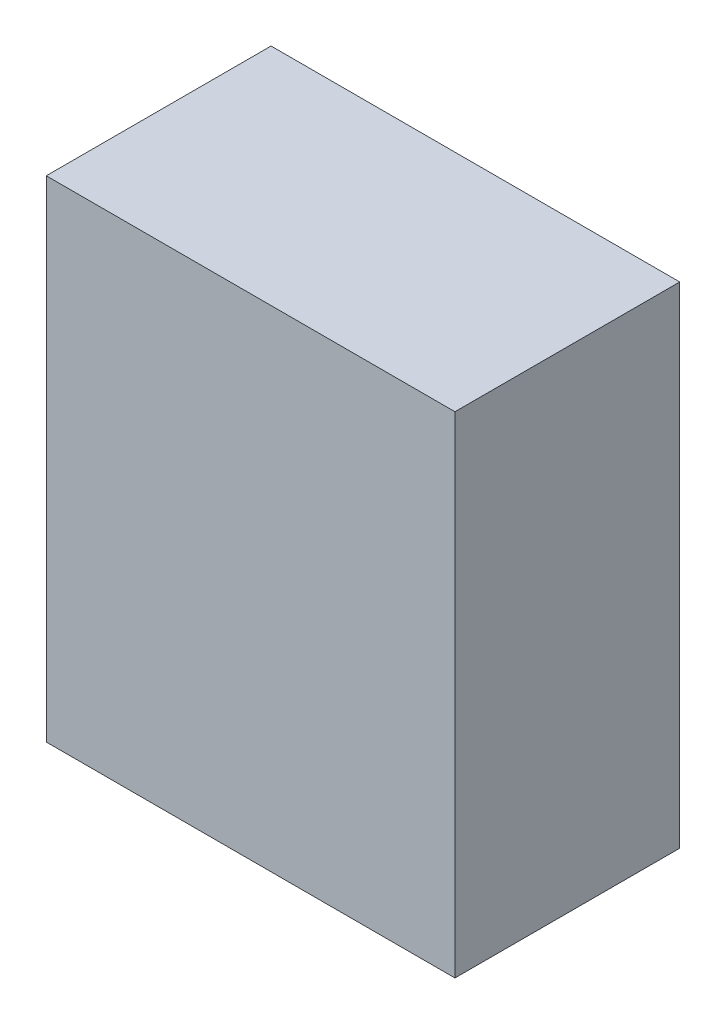
ISO-10303-21;
HEADER;
FILE_DESCRIPTION(('STEP AP214'),'2;1');
FILE_NAME('part.step','',(''),(''),'','','');
FILE_SCHEMA(('AUTOMOTIVE_DESIGN { 1 0 10303 214 1 1 1 1 }'));
ENDSEC;
DATA;
#1=APPLICATION_CONTEXT('core data for automotive mechanical design processes');
#2=APPLICATION_PROTOCOL_DEFINITION('international standard','automotive_design',2000,#1);
#3=PRODUCT_CONTEXT('',#1,'mechanical');
#4=PRODUCT('Part','Part','',(#3));
#5=PRODUCT_RELATED_PRODUCT_CATEGORY('part','',(#4));
#6=PRODUCT_DEFINITION_FORMATION('','',#4);
#7=PRODUCT_DEFINITION_CONTEXT('part definition',#1,'design');
#8=PRODUCT_DEFINITION('design','',#6,#7);
#9=PRODUCT_DEFINITION_SHAPE('','',#8);
#10=(LENGTH_UNIT() NAMED_UNIT(*) SI_UNIT(.MILLI.,.METRE.));
#11=(NAMED_UNIT(*) PLANE_ANGLE_UNIT() SI_UNIT($,.RADIAN.));
#12=(NAMED_UNIT(*) SI_UNIT($,.STERADIAN.) SOLID_ANGLE_UNIT());
#13=UNCERTAINTY_MEASURE_WITH_UNIT(LENGTH_MEASURE(1.E-05),#10,'distance_accuracy_value','');
#14=(GEOMETRIC_REPRESENTATION_CONTEXT(3) GLOBAL_UNCERTAINTY_ASSIGNED_CONTEXT((#13)) GLOBAL_UNIT_ASSIGNED_CONTEXT((#10,
#11,#12)) REPRESENTATION_CONTEXT('',''));
#15=CARTESIAN_POINT('',(0.,0.,0.));
#16=DIRECTION('',(0.,0.,1.));
#17=DIRECTION('',(1.,0.,0.));
#18=AXIS2_PLACEMENT_3D('',#15,#16,#17);
#19=CARTESIAN_POINT('',(0.50000154,0.60000134,0.5499989));
#20=DIRECTION('',(0.,0.,-1.));
#21=DIRECTION('',(-1.,0.,0.));
#22=AXIS2_PLACEMENT_3D('',#19,#20,#21);
#23=PLANE('',#22);
#24=DIRECTION('',(0.,1.,0.));
#25=VECTOR('',#24,1.);
#26=CARTESIAN_POINT('',(-0.499999,0.60000134,0.5499989));
#27=LINE('',#26,#25);
#28=CARTESIAN_POINT('',(-0.499999,0.60000134,0.5499989));
#29=VERTEX_POINT('',#28);
#30=CARTESIAN_POINT('',(-0.499999,-0.5999988,0.5499989));
#31=VERTEX_POINT('',#30);
#32=EDGE_CURVE('E55',#29,#31,#27,.F.);
#33=ORIENTED_EDGE('',*,*,#32,.T.);
#34=DIRECTION('',(1.,0.,0.));
#35=VECTOR('',#34,1.);
#36=CARTESIAN_POINT('',(-0.499999,-0.5999988,0.5499989));
#37=LINE('',#36,#35);
#38=CARTESIAN_POINT('',(0.50000154,-0.5999988,0.5499989));
#39=VERTEX_POINT('',#38);
#40=EDGE_CURVE('E57',#31,#39,#37,.T.);
#41=ORIENTED_EDGE('',*,*,#40,.T.);
#42=DIRECTION('',(0.,1.,0.));
#43=VECTOR('',#42,1.);
#44=CARTESIAN_POINT('',(0.50000154,-0.5999988,0.5499989));
#45=LINE('',#44,#43);
#46=CARTESIAN_POINT('',(0.50000154,0.60000134,0.5499989));
#47=VERTEX_POINT('',#46);
#48=EDGE_CURVE('E20',#39,#47,#45,.T.);
#49=ORIENTED_EDGE('',*,*,#48,.T.);
#50=DIRECTION('',(1.,0.,0.));
#51=VECTOR('',#50,1.);
#52=CARTESIAN_POINT('',(0.50000154,0.60000134,0.5499989));
#53=LINE('',#52,#51);
#54=EDGE_CURVE('E80',#47,#29,#53,.F.);
#55=ORIENTED_EDGE('',*,*,#54,.T.);
#56=EDGE_LOOP('',(#33,#41,#49,#55));
#57=FACE_BOUND('',#56,.T.);
#58=ADVANCED_FACE('F17',(#57),#23,.F.);
#59=CARTESIAN_POINT('',(0.50000154,-0.5999988,0.));
#60=DIRECTION('',(-1.,0.,0.));
#61=DIRECTION('',(0.,0.,1.));
#62=AXIS2_PLACEMENT_3D('',#59,#60,#61);
#63=PLANE('',#62);
#64=DIRECTION('',(0.,0.,-1.));
#65=VECTOR('',#64,1.);
#66=CARTESIAN_POINT('',(0.50000154,0.60000134,0.));
#67=LINE('',#66,#65);
#68=CARTESIAN_POINT('',(0.50000154,0.60000134,0.));
#69=VERTEX_POINT('',#68);
#70=EDGE_CURVE('E68',#69,#47,#67,.F.);
#71=ORIENTED_EDGE('',*,*,#70,.T.);
#72=ORIENTED_EDGE('',*,*,#48,.F.);
#73=DIRECTION('',(0.,0.,1.));
#74=VECTOR('',#73,1.);
#75=CARTESIAN_POINT('',(0.50000154,-0.5999988,0.));
#76=LINE('',#75,#74);
#77=CARTESIAN_POINT('',(0.50000154,-0.5999988,0.));
#78=VERTEX_POINT('',#77);
#79=EDGE_CURVE('E63',#39,#78,#76,.F.);
#80=ORIENTED_EDGE('',*,*,#79,.T.);
#81=DIRECTION('',(0.,1.,0.));
#82=VECTOR('',#81,1.);
#83=CARTESIAN_POINT('',(0.50000154,0.60000134,0.));
#84=LINE('',#83,#82);
#85=EDGE_CURVE('E83',#69,#78,#84,.F.);
#86=ORIENTED_EDGE('',*,*,#85,.F.);
#87=EDGE_LOOP('',(#71,#72,#80,#86));
#88=FACE_BOUND('',#87,.T.);
#89=ADVANCED_FACE('F65',(#88),#63,.F.);
#90=CARTESIAN_POINT('',(-0.499999,-0.5999988,0.));
#91=DIRECTION('',(0.,1.,0.));
#92=DIRECTION('',(0.,0.,1.));
#93=AXIS2_PLACEMENT_3D('',#90,#91,#92);
#94=PLANE('',#93);
#95=ORIENTED_EDGE('',*,*,#79,.F.);
#96=ORIENTED_EDGE('',*,*,#40,.F.);
#97=DIRECTION('',(0.,0.,-1.));
#98=VECTOR('',#97,1.);
#99=CARTESIAN_POINT('',(-0.499999,-0.5999988,0.));
#100=LINE('',#99,#98);
#101=CARTESIAN_POINT('',(-0.499999,-0.5999988,0.));
#102=VERTEX_POINT('',#101);
#103=EDGE_CURVE('E75',#31,#102,#100,.T.);
#104=ORIENTED_EDGE('',*,*,#103,.T.);
#105=DIRECTION('',(-1.,0.,0.));
#106=VECTOR('',#105,1.);
#107=CARTESIAN_POINT('',(0.50000154,-0.5999988,0.));
#108=LINE('',#107,#106);
#109=EDGE_CURVE('E72',#78,#102,#108,.T.);
#110=ORIENTED_EDGE('',*,*,#109,.F.);
#111=EDGE_LOOP('',(#95,#96,#104,#110));
#112=FACE_BOUND('',#111,.T.);
#113=ADVANCED_FACE('F70',(#112),#94,.F.);
#114=CARTESIAN_POINT('',(-0.499999,0.60000134,0.));
#115=DIRECTION('',(1.,0.,0.));
#116=DIRECTION('',(0.,0.,-1.));
#117=AXIS2_PLACEMENT_3D('',#114,#115,#116);
#118=PLANE('',#117);
#119=ORIENTED_EDGE('',*,*,#103,.F.);
#120=ORIENTED_EDGE('',*,*,#32,.F.);
#121=DIRECTION('',(0.,0.,-1.));
#122=VECTOR('',#121,1.);
#123=CARTESIAN_POINT('',(-0.499999,0.60000134,0.));
#124=LINE('',#123,#122);
#125=CARTESIAN_POINT('',(-0.499999,0.60000134,0.));
#126=VERTEX_POINT('',#125);
#127=EDGE_CURVE('E35',#29,#126,#124,.T.);
#128=ORIENTED_EDGE('',*,*,#127,.T.);
#129=DIRECTION('',(0.,1.,0.));
#130=VECTOR('',#129,1.);
#131=CARTESIAN_POINT('',(-0.499999,0.60000134,0.));
#132=LINE('',#131,#130);
#133=EDGE_CURVE('E26',#102,#126,#132,.T.);
#134=ORIENTED_EDGE('',*,*,#133,.F.);
#135=EDGE_LOOP('',(#119,#120,#128,#134));
#136=FACE_BOUND('',#135,.T.);
#137=ADVANCED_FACE('F89',(#136),#118,.F.);
#138=CARTESIAN_POINT('',(0.50000154,0.60000134,0.));
#139=DIRECTION('',(0.,-1.,0.));
#140=DIRECTION('',(0.,0.,-1.));
#141=AXIS2_PLACEMENT_3D('',#138,#139,#140);
#142=PLANE('',#141);
#143=ORIENTED_EDGE('',*,*,#127,.F.);
#144=ORIENTED_EDGE('',*,*,#54,.F.);
#145=ORIENTED_EDGE('',*,*,#70,.F.);
#146=DIRECTION('',(-1.,0.,0.));
#147=VECTOR('',#146,1.);
#148=CARTESIAN_POINT('',(0.50000154,0.60000134,0.));
#149=LINE('',#148,#147);
#150=EDGE_CURVE('E11',#126,#69,#149,.F.);
#151=ORIENTED_EDGE('',*,*,#150,.F.);
#152=EDGE_LOOP('',(#143,#144,#145,#151));
#153=FACE_BOUND('',#152,.T.);
#154=ADVANCED_FACE('F91',(#153),#142,.F.);
#155=CARTESIAN_POINT('',(0.50000154,0.60000134,0.));
#156=DIRECTION('',(0.,0.,-1.));
#157=DIRECTION('',(-1.,0.,0.));
#158=AXIS2_PLACEMENT_3D('',#155,#156,#157);
#159=PLANE('',#158);
#160=ORIENTED_EDGE('',*,*,#133,.T.);
#161=ORIENTED_EDGE('',*,*,#150,.T.);
#162=ORIENTED_EDGE('',*,*,#85,.T.);
#163=ORIENTED_EDGE('',*,*,#109,.T.);
#164=EDGE_LOOP('',(#160,#161,#162,#163));
#165=FACE_BOUND('',#164,.T.);
#166=ADVANCED_FACE('F88',(#165),#159,.T.);
#167=CLOSED_SHELL('',(#58,#89,#113,#137,#154,#166));
#168=MANIFOLD_SOLID_BREP('B1',#167);
#169=ADVANCED_BREP_SHAPE_REPRESENTATION('',(#18,#168),#14);
#170=SHAPE_DEFINITION_REPRESENTATION(#9,#169);
ENDSEC;
END-ISO-10303-21;
